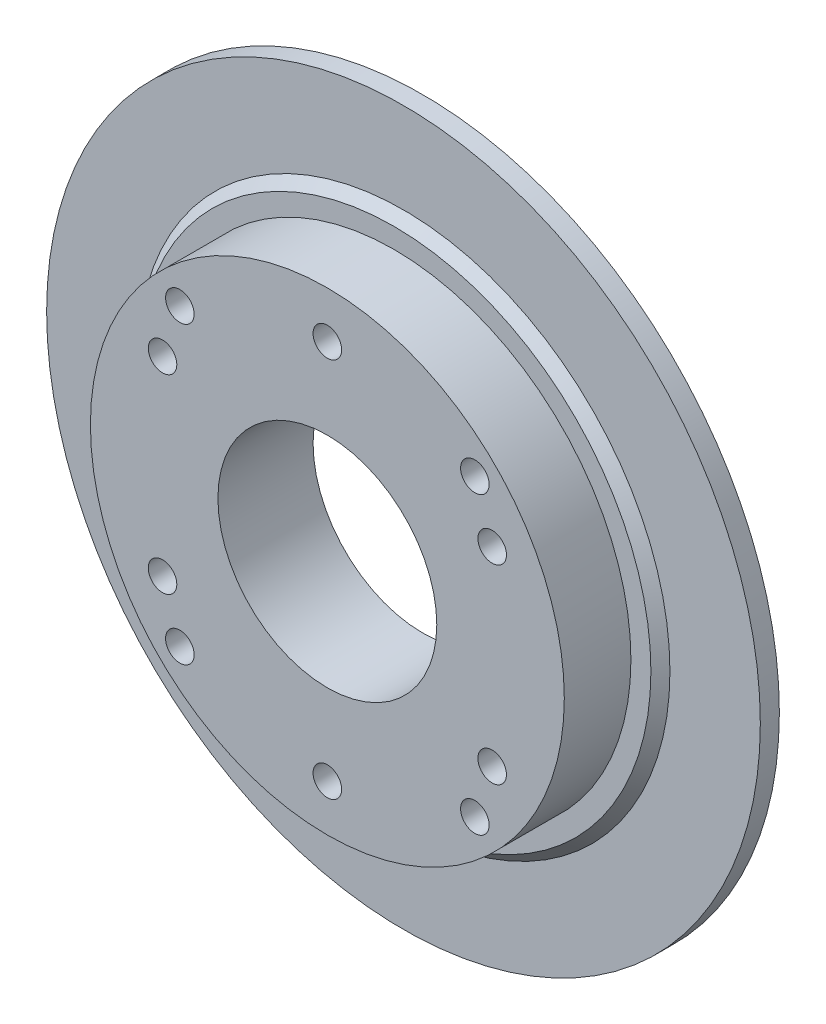
ISO-10303-21;
HEADER;
FILE_DESCRIPTION(('STEP AP214'),'2;1');
FILE_NAME('part.step','',(''),(''),'','','');
FILE_SCHEMA(('AUTOMOTIVE_DESIGN { 1 0 10303 214 1 1 1 1 }'));
ENDSEC;
DATA;
#1=APPLICATION_CONTEXT('core data for automotive mechanical design processes');
#2=APPLICATION_PROTOCOL_DEFINITION('international standard','automotive_design',2000,#1);
#3=PRODUCT_CONTEXT('',#1,'mechanical');
#4=PRODUCT('Part','Part','',(#3));
#5=PRODUCT_RELATED_PRODUCT_CATEGORY('part','',(#4));
#6=PRODUCT_DEFINITION_FORMATION('','',#4);
#7=PRODUCT_DEFINITION_CONTEXT('part definition',#1,'design');
#8=PRODUCT_DEFINITION('design','',#6,#7);
#9=PRODUCT_DEFINITION_SHAPE('','',#8);
#10=(LENGTH_UNIT() NAMED_UNIT(*) SI_UNIT(.MILLI.,.METRE.));
#11=(NAMED_UNIT(*) PLANE_ANGLE_UNIT() SI_UNIT($,.RADIAN.));
#12=(NAMED_UNIT(*) SI_UNIT($,.STERADIAN.) SOLID_ANGLE_UNIT());
#13=UNCERTAINTY_MEASURE_WITH_UNIT(LENGTH_MEASURE(1.E-05),#10,'distance_accuracy_value','');
#14=(GEOMETRIC_REPRESENTATION_CONTEXT(3) GLOBAL_UNCERTAINTY_ASSIGNED_CONTEXT((#13)) GLOBAL_UNIT_ASSIGNED_CONTEXT((#10,
#11,#12)) REPRESENTATION_CONTEXT('',''));
#15=CARTESIAN_POINT('',(0.,0.,0.));
#16=DIRECTION('',(0.,0.,1.));
#17=DIRECTION('',(1.,0.,0.));
#18=AXIS2_PLACEMENT_3D('',#15,#16,#17);
#19=CARTESIAN_POINT('',(0.,0.,2.));
#20=DIRECTION('',(0.,0.,-1.));
#21=DIRECTION('',(-1.,0.,0.));
#22=AXIS2_PLACEMENT_3D('',#19,#20,#21);
#23=CYLINDRICAL_SURFACE('',#22,37.5);
#24=CARTESIAN_POINT('',(0.,0.,2.));
#25=DIRECTION('',(0.,0.,1.));
#26=DIRECTION('',(1.,0.,0.));
#27=AXIS2_PLACEMENT_3D('',#24,#25,#26);
#28=CIRCLE('',#27,37.5);
#29=CARTESIAN_POINT('',(37.5,0.,2.));
#30=VERTEX_POINT('',#29);
#31=EDGE_CURVE('E56',#30,#30,#28,.T.);
#32=ORIENTED_EDGE('',*,*,#31,.F.);
#33=EDGE_LOOP('',(#32));
#34=FACE_BOUND('',#33,.T.);
#35=CARTESIAN_POINT('',(0.,0.,0.));
#36=DIRECTION('',(0.,0.,1.));
#37=DIRECTION('',(1.,0.,0.));
#38=AXIS2_PLACEMENT_3D('',#35,#36,#37);
#39=CIRCLE('',#38,37.5);
#40=CARTESIAN_POINT('',(37.5,0.,0.));
#41=VERTEX_POINT('',#40);
#42=EDGE_CURVE('E63',#41,#41,#39,.T.);
#43=ORIENTED_EDGE('',*,*,#42,.T.);
#44=EDGE_LOOP('',(#43));
#45=FACE_BOUND('',#44,.T.);
#46=ADVANCED_FACE('F39',(#34,#45),#23,.T.);
#47=CARTESIAN_POINT('',(0.,0.,2.));
#48=DIRECTION('',(0.,0.,1.));
#49=DIRECTION('',(1.,0.,0.));
#50=AXIS2_PLACEMENT_3D('',#47,#48,#49);
#51=PLANE('',#50);
#52=CARTESIAN_POINT('',(0.,0.,2.));
#53=DIRECTION('',(0.,0.,1.));
#54=DIRECTION('',(1.,0.,0.));
#55=AXIS2_PLACEMENT_3D('',#52,#53,#54);
#56=CIRCLE('',#55,28.);
#57=CARTESIAN_POINT('',(28.,0.,2.));
#58=VERTEX_POINT('',#57);
#59=EDGE_CURVE('E51',#58,#58,#56,.T.);
#60=ORIENTED_EDGE('',*,*,#59,.F.);
#61=EDGE_LOOP('',(#60));
#62=FACE_BOUND('',#61,.T.);
#63=ORIENTED_EDGE('',*,*,#31,.T.);
#64=EDGE_LOOP('',(#63));
#65=FACE_BOUND('',#64,.T.);
#66=ADVANCED_FACE('F185',(#62,#65),#51,.T.);
#67=CARTESIAN_POINT('',(0.,0.,0.));
#68=DIRECTION('',(0.,0.,1.));
#69=DIRECTION('',(1.,0.,0.));
#70=AXIS2_PLACEMENT_3D('',#67,#68,#69);
#71=PLANE('',#70);
#72=CARTESIAN_POINT('',(-15.4999999999997,-15.5,0.));
#73=DIRECTION('',(0.,0.,1.));
#74=DIRECTION('',(1.,0.,0.));
#75=AXIS2_PLACEMENT_3D('',#72,#73,#74);
#76=CIRCLE('',#75,1.5);
#77=CARTESIAN_POINT('',(-13.9999999999997,-15.5,0.));
#78=VERTEX_POINT('',#77);
#79=EDGE_CURVE('E85',#78,#78,#76,.T.);
#80=ORIENTED_EDGE('',*,*,#79,.T.);
#81=EDGE_LOOP('',(#80));
#82=FACE_BOUND('',#81,.T.);
#83=CARTESIAN_POINT('',(15.5000000000003,-15.5,0.));
#84=DIRECTION('',(0.,0.,1.));
#85=DIRECTION('',(1.,0.,0.));
#86=AXIS2_PLACEMENT_3D('',#83,#84,#85);
#87=CIRCLE('',#86,1.5);
#88=CARTESIAN_POINT('',(17.0000000000003,-15.5,0.));
#89=VERTEX_POINT('',#88);
#90=EDGE_CURVE('E92',#89,#89,#87,.T.);
#91=ORIENTED_EDGE('',*,*,#90,.T.);
#92=EDGE_LOOP('',(#91));
#93=FACE_BOUND('',#92,.T.);
#94=CARTESIAN_POINT('',(15.5,15.5,0.));
#95=DIRECTION('',(0.,0.,1.));
#96=DIRECTION('',(1.,0.,0.));
#97=AXIS2_PLACEMENT_3D('',#94,#95,#96);
#98=CIRCLE('',#97,1.5);
#99=CARTESIAN_POINT('',(17.,15.5,0.));
#100=VERTEX_POINT('',#99);
#101=EDGE_CURVE('E98',#100,#100,#98,.T.);
#102=ORIENTED_EDGE('',*,*,#101,.T.);
#103=EDGE_LOOP('',(#102));
#104=FACE_BOUND('',#103,.T.);
#105=CARTESIAN_POINT('',(-15.5,15.5,0.));
#106=DIRECTION('',(0.,0.,1.));
#107=DIRECTION('',(1.,0.,0.));
#108=AXIS2_PLACEMENT_3D('',#105,#106,#107);
#109=CIRCLE('',#108,1.5);
#110=CARTESIAN_POINT('',(-14.,15.5,0.));
#111=VERTEX_POINT('',#110);
#112=EDGE_CURVE('E77',#111,#111,#109,.T.);
#113=ORIENTED_EDGE('',*,*,#112,.T.);
#114=EDGE_LOOP('',(#113));
#115=FACE_BOUND('',#114,.T.);
#116=CARTESIAN_POINT('',(0.,0.,0.));
#117=DIRECTION('',(0.,0.,1.));
#118=DIRECTION('',(1.,0.,0.));
#119=AXIS2_PLACEMENT_3D('',#116,#117,#118);
#120=CIRCLE('',#119,11.5);
#121=CARTESIAN_POINT('',(11.5,0.,0.));
#122=VERTEX_POINT('',#121);
#123=EDGE_CURVE('E68',#122,#122,#120,.T.);
#124=ORIENTED_EDGE('',*,*,#123,.T.);
#125=EDGE_LOOP('',(#124));
#126=FACE_BOUND('',#125,.T.);
#127=ORIENTED_EDGE('',*,*,#42,.F.);
#128=EDGE_LOOP('',(#127));
#129=FACE_BOUND('',#128,.T.);
#130=ADVANCED_FACE('F190',(#82,#93,#104,#115,#126,#129),#71,.F.);
#131=CARTESIAN_POINT('',(0.,0.,3.));
#132=DIRECTION('',(0.,0.,1.));
#133=DIRECTION('',(1.,0.,0.));
#134=AXIS2_PLACEMENT_3D('',#131,#132,#133);
#135=PLANE('',#134);
#136=CARTESIAN_POINT('',(0.,0.,3.));
#137=DIRECTION('',(0.,0.,1.));
#138=DIRECTION('',(1.,0.,0.));
#139=AXIS2_PLACEMENT_3D('',#136,#137,#138);
#140=CIRCLE('',#139,27.);
#141=CARTESIAN_POINT('',(27.,0.,3.));
#142=VERTEX_POINT('',#141);
#143=EDGE_CURVE('E10',#142,#142,#140,.T.);
#144=ORIENTED_EDGE('',*,*,#143,.T.);
#145=EDGE_LOOP('',(#144));
#146=FACE_BOUND('',#145,.T.);
#147=CARTESIAN_POINT('',(0.,0.,3.));
#148=DIRECTION('',(0.,0.,1.));
#149=DIRECTION('',(1.,0.,0.));
#150=AXIS2_PLACEMENT_3D('',#147,#148,#149);
#151=CIRCLE('',#150,24.9);
#152=CARTESIAN_POINT('',(24.9,0.,3.));
#153=VERTEX_POINT('',#152);
#154=EDGE_CURVE('E47',#153,#153,#151,.T.);
#155=ORIENTED_EDGE('',*,*,#154,.F.);
#156=EDGE_LOOP('',(#155));
#157=FACE_BOUND('',#156,.T.);
#158=ADVANCED_FACE('F196',(#146,#157),#135,.T.);
#159=CARTESIAN_POINT('',(0.,0.,10.));
#160=DIRECTION('',(0.,0.,-1.));
#161=DIRECTION('',(-1.,0.,0.));
#162=AXIS2_PLACEMENT_3D('',#159,#160,#161);
#163=CYLINDRICAL_SURFACE('',#162,24.9);
#164=CARTESIAN_POINT('',(0.,0.,10.));
#165=DIRECTION('',(0.,0.,1.));
#166=DIRECTION('',(1.,0.,0.));
#167=AXIS2_PLACEMENT_3D('',#164,#165,#166);
#168=CIRCLE('',#167,24.9);
#169=CARTESIAN_POINT('',(24.9,0.,10.));
#170=VERTEX_POINT('',#169);
#171=EDGE_CURVE('E59',#170,#170,#168,.T.);
#172=ORIENTED_EDGE('',*,*,#171,.F.);
#173=EDGE_LOOP('',(#172));
#174=FACE_BOUND('',#173,.T.);
#175=ORIENTED_EDGE('',*,*,#154,.T.);
#176=EDGE_LOOP('',(#175));
#177=FACE_BOUND('',#176,.T.);
#178=ADVANCED_FACE('F152',(#174,#177),#163,.T.);
#179=CARTESIAN_POINT('',(0.,0.,10.));
#180=DIRECTION('',(0.,0.,1.));
#181=DIRECTION('',(1.,0.,0.));
#182=AXIS2_PLACEMENT_3D('',#179,#180,#181);
#183=PLANE('',#182);
#184=CARTESIAN_POINT('',(1.35308431126191E-13,20.,10.));
#185=DIRECTION('',(0.,0.,1.));
#186=DIRECTION('',(1.,0.,0.));
#187=AXIS2_PLACEMENT_3D('',#184,#185,#186);
#188=CIRCLE('',#187,1.5);
#189=CARTESIAN_POINT('',(1.50000000000014,20.,10.));
#190=VERTEX_POINT('',#189);
#191=EDGE_CURVE('E128',#190,#190,#188,.T.);
#192=ORIENTED_EDGE('',*,*,#191,.F.);
#193=EDGE_LOOP('',(#192));
#194=FACE_BOUND('',#193,.T.);
#195=CARTESIAN_POINT('',(-17.3205080756887,10.0000000000001,10.));
#196=DIRECTION('',(0.,0.,1.));
#197=DIRECTION('',(1.,0.,0.));
#198=AXIS2_PLACEMENT_3D('',#195,#196,#197);
#199=CIRCLE('',#198,1.5);
#200=CARTESIAN_POINT('',(-15.8205080756887,10.0000000000001,10.));
#201=VERTEX_POINT('',#200);
#202=EDGE_CURVE('E107',#201,#201,#199,.T.);
#203=ORIENTED_EDGE('',*,*,#202,.F.);
#204=EDGE_LOOP('',(#203));
#205=FACE_BOUND('',#204,.T.);
#206=CARTESIAN_POINT('',(17.3205080756889,9.99999999999984,10.));
#207=DIRECTION('',(0.,0.,1.));
#208=DIRECTION('',(1.,0.,0.));
#209=AXIS2_PLACEMENT_3D('',#206,#207,#208);
#210=CIRCLE('',#209,1.5);
#211=CARTESIAN_POINT('',(18.8205080756889,9.99999999999984,10.));
#212=VERTEX_POINT('',#211);
#213=EDGE_CURVE('E106',#212,#212,#210,.T.);
#214=ORIENTED_EDGE('',*,*,#213,.F.);
#215=EDGE_LOOP('',(#214));
#216=FACE_BOUND('',#215,.T.);
#217=CARTESIAN_POINT('',(17.3205080756887,-10.0000000000002,10.));
#218=DIRECTION('',(0.,0.,1.));
#219=DIRECTION('',(1.,0.,0.));
#220=AXIS2_PLACEMENT_3D('',#217,#218,#219);
#221=CIRCLE('',#220,1.5);
#222=CARTESIAN_POINT('',(18.8205080756887,-10.0000000000002,10.));
#223=VERTEX_POINT('',#222);
#224=EDGE_CURVE('E113',#223,#223,#221,.T.);
#225=ORIENTED_EDGE('',*,*,#224,.F.);
#226=EDGE_LOOP('',(#225));
#227=FACE_BOUND('',#226,.T.);
#228=CARTESIAN_POINT('',(-2.81025203108243E-13,-20.,10.));
#229=DIRECTION('',(0.,0.,1.));
#230=DIRECTION('',(1.,0.,0.));
#231=AXIS2_PLACEMENT_3D('',#228,#229,#230);
#232=CIRCLE('',#231,1.5);
#233=CARTESIAN_POINT('',(1.49999999999972,-20.,10.));
#234=VERTEX_POINT('',#233);
#235=EDGE_CURVE('E119',#234,#234,#232,.T.);
#236=ORIENTED_EDGE('',*,*,#235,.F.);
#237=EDGE_LOOP('',(#236));
#238=FACE_BOUND('',#237,.T.);
#239=CARTESIAN_POINT('',(-17.3205080756888,-9.99999999999996,10.));
#240=DIRECTION('',(0.,0.,1.));
#241=DIRECTION('',(1.,0.,0.));
#242=AXIS2_PLACEMENT_3D('',#239,#240,#241);
#243=CIRCLE('',#242,1.5);
#244=CARTESIAN_POINT('',(-15.8205080756888,-9.99999999999996,10.));
#245=VERTEX_POINT('',#244);
#246=EDGE_CURVE('E125',#245,#245,#243,.T.);
#247=ORIENTED_EDGE('',*,*,#246,.F.);
#248=EDGE_LOOP('',(#247));
#249=FACE_BOUND('',#248,.T.);
#250=CARTESIAN_POINT('',(-15.4999999999997,-15.5,10.));
#251=DIRECTION('',(0.,0.,1.));
#252=DIRECTION('',(1.,0.,0.));
#253=AXIS2_PLACEMENT_3D('',#250,#251,#252);
#254=CIRCLE('',#253,1.5);
#255=CARTESIAN_POINT('',(-13.9999999999997,-15.5,10.));
#256=VERTEX_POINT('',#255);
#257=EDGE_CURVE('E88',#256,#256,#254,.T.);
#258=ORIENTED_EDGE('',*,*,#257,.F.);
#259=EDGE_LOOP('',(#258));
#260=FACE_BOUND('',#259,.T.);
#261=CARTESIAN_POINT('',(15.5000000000003,-15.5,10.));
#262=DIRECTION('',(0.,0.,1.));
#263=DIRECTION('',(1.,0.,0.));
#264=AXIS2_PLACEMENT_3D('',#261,#262,#263);
#265=CIRCLE('',#264,1.5);
#266=CARTESIAN_POINT('',(17.0000000000003,-15.5,10.));
#267=VERTEX_POINT('',#266);
#268=EDGE_CURVE('E95',#267,#267,#265,.T.);
#269=ORIENTED_EDGE('',*,*,#268,.F.);
#270=EDGE_LOOP('',(#269));
#271=FACE_BOUND('',#270,.T.);
#272=CARTESIAN_POINT('',(15.5,15.5,10.));
#273=DIRECTION('',(0.,0.,1.));
#274=DIRECTION('',(1.,0.,0.));
#275=AXIS2_PLACEMENT_3D('',#272,#273,#274);
#276=CIRCLE('',#275,1.5);
#277=CARTESIAN_POINT('',(17.,15.5,10.));
#278=VERTEX_POINT('',#277);
#279=EDGE_CURVE('E82',#278,#278,#276,.T.);
#280=ORIENTED_EDGE('',*,*,#279,.F.);
#281=EDGE_LOOP('',(#280));
#282=FACE_BOUND('',#281,.T.);
#283=CARTESIAN_POINT('',(-15.5,15.5,10.));
#284=DIRECTION('',(0.,0.,1.));
#285=DIRECTION('',(1.,0.,0.));
#286=AXIS2_PLACEMENT_3D('',#283,#284,#285);
#287=CIRCLE('',#286,1.5);
#288=CARTESIAN_POINT('',(-14.,15.5,10.));
#289=VERTEX_POINT('',#288);
#290=EDGE_CURVE('E79',#289,#289,#287,.T.);
#291=ORIENTED_EDGE('',*,*,#290,.F.);
#292=EDGE_LOOP('',(#291));
#293=FACE_BOUND('',#292,.T.);
#294=CARTESIAN_POINT('',(0.,0.,10.));
#295=DIRECTION('',(0.,0.,1.));
#296=DIRECTION('',(1.,0.,0.));
#297=AXIS2_PLACEMENT_3D('',#294,#295,#296);
#298=CIRCLE('',#297,11.5);
#299=CARTESIAN_POINT('',(11.5,0.,10.));
#300=VERTEX_POINT('',#299);
#301=EDGE_CURVE('E72',#300,#300,#298,.T.);
#302=ORIENTED_EDGE('',*,*,#301,.F.);
#303=EDGE_LOOP('',(#302));
#304=FACE_BOUND('',#303,.T.);
#305=ORIENTED_EDGE('',*,*,#171,.T.);
#306=EDGE_LOOP('',(#305));
#307=FACE_BOUND('',#306,.T.);
#308=ADVANCED_FACE('F148',(#194,#205,#216,#227,#238,#249,#260,#271,#282,#293,#304,#307),#183,.T.);
#309=CARTESIAN_POINT('',(0.,0.,0.));
#310=DIRECTION('',(0.,0.,1.));
#311=DIRECTION('',(1.,0.,0.));
#312=AXIS2_PLACEMENT_3D('',#309,#310,#311);
#313=CYLINDRICAL_SURFACE('',#312,11.5);
#314=ORIENTED_EDGE('',*,*,#123,.F.);
#315=EDGE_LOOP('',(#314));
#316=FACE_BOUND('',#315,.T.);
#317=ORIENTED_EDGE('',*,*,#301,.T.);
#318=EDGE_LOOP('',(#317));
#319=FACE_BOUND('',#318,.T.);
#320=ADVANCED_FACE('F151',(#316,#319),#313,.F.);
#321=CARTESIAN_POINT('',(-15.5,15.5,0.));
#322=DIRECTION('',(0.,0.,1.));
#323=DIRECTION('',(1.,0.,0.));
#324=AXIS2_PLACEMENT_3D('',#321,#322,#323);
#325=CYLINDRICAL_SURFACE('',#324,1.5);
#326=ORIENTED_EDGE('',*,*,#112,.F.);
#327=EDGE_LOOP('',(#326));
#328=FACE_BOUND('',#327,.T.);
#329=ORIENTED_EDGE('',*,*,#290,.T.);
#330=EDGE_LOOP('',(#329));
#331=FACE_BOUND('',#330,.T.);
#332=ADVANCED_FACE('F175',(#328,#331),#325,.F.);
#333=CARTESIAN_POINT('',(15.5,15.5,0.));
#334=DIRECTION('',(0.,0.,1.));
#335=DIRECTION('',(1.,0.,0.));
#336=AXIS2_PLACEMENT_3D('',#333,#334,#335);
#337=CYLINDRICAL_SURFACE('',#336,1.5);
#338=ORIENTED_EDGE('',*,*,#101,.F.);
#339=EDGE_LOOP('',(#338));
#340=FACE_BOUND('',#339,.T.);
#341=ORIENTED_EDGE('',*,*,#279,.T.);
#342=EDGE_LOOP('',(#341));
#343=FACE_BOUND('',#342,.T.);
#344=ADVANCED_FACE('F181',(#340,#343),#337,.F.);
#345=CARTESIAN_POINT('',(15.5000000000003,-15.5,0.));
#346=DIRECTION('',(0.,0.,1.));
#347=DIRECTION('',(1.,0.,0.));
#348=AXIS2_PLACEMENT_3D('',#345,#346,#347);
#349=CYLINDRICAL_SURFACE('',#348,1.5);
#350=ORIENTED_EDGE('',*,*,#90,.F.);
#351=EDGE_LOOP('',(#350));
#352=FACE_BOUND('',#351,.T.);
#353=ORIENTED_EDGE('',*,*,#268,.T.);
#354=EDGE_LOOP('',(#353));
#355=FACE_BOUND('',#354,.T.);
#356=ADVANCED_FACE('F370',(#352,#355),#349,.F.);
#357=CARTESIAN_POINT('',(-15.4999999999997,-15.5,0.));
#358=DIRECTION('',(0.,0.,1.));
#359=DIRECTION('',(1.,0.,0.));
#360=AXIS2_PLACEMENT_3D('',#357,#358,#359);
#361=CYLINDRICAL_SURFACE('',#360,1.5);
#362=ORIENTED_EDGE('',*,*,#79,.F.);
#363=EDGE_LOOP('',(#362));
#364=FACE_BOUND('',#363,.T.);
#365=ORIENTED_EDGE('',*,*,#257,.T.);
#366=EDGE_LOOP('',(#365));
#367=FACE_BOUND('',#366,.T.);
#368=ADVANCED_FACE('F362',(#364,#367),#361,.F.);
#369=CARTESIAN_POINT('',(0.,0.,3.));
#370=DIRECTION('',(0.,0.,-1.));
#371=DIRECTION('',(-1.,0.,0.));
#372=AXIS2_PLACEMENT_3D('',#369,#370,#371);
#373=CONICAL_SURFACE('',#372,27.,0.785398163397448);
#374=ORIENTED_EDGE('',*,*,#59,.T.);
#375=EDGE_LOOP('',(#374));
#376=FACE_BOUND('',#375,.T.);
#377=ORIENTED_EDGE('',*,*,#143,.F.);
#378=EDGE_LOOP('',(#377));
#379=FACE_BOUND('',#378,.T.);
#380=ADVANCED_FACE('F42',(#376,#379),#373,.T.);
#381=CARTESIAN_POINT('',(-17.3205080756888,-9.99999999999996,7.));
#382=DIRECTION('',(0.,0.,1.));
#383=DIRECTION('',(1.,0.,0.));
#384=AXIS2_PLACEMENT_3D('',#381,#382,#383);
#385=CYLINDRICAL_SURFACE('',#384,1.5);
#386=CARTESIAN_POINT('',(-17.3205080756888,-9.99999999999996,7.));
#387=DIRECTION('',(0.,0.,1.));
#388=DIRECTION('',(1.,0.,0.));
#389=AXIS2_PLACEMENT_3D('',#386,#387,#388);
#390=CIRCLE('',#389,1.5);
#391=CARTESIAN_POINT('',(-15.8205080756888,-9.99999999999996,7.));
#392=VERTEX_POINT('',#391);
#393=EDGE_CURVE('E122',#392,#392,#390,.T.);
#394=ORIENTED_EDGE('',*,*,#393,.F.);
#395=EDGE_LOOP('',(#394));
#396=FACE_BOUND('',#395,.T.);
#397=ORIENTED_EDGE('',*,*,#246,.T.);
#398=EDGE_LOOP('',(#397));
#399=FACE_BOUND('',#398,.T.);
#400=ADVANCED_FACE('F223',(#396,#399),#385,.F.);
#401=CARTESIAN_POINT('',(-17.3205080756888,-9.99999999999996,7.));
#402=DIRECTION('',(0.,0.,1.));
#403=DIRECTION('',(1.,0.,0.));
#404=AXIS2_PLACEMENT_3D('',#401,#402,#403);
#405=PLANE('',#404);
#406=ORIENTED_EDGE('',*,*,#393,.T.);
#407=EDGE_LOOP('',(#406));
#408=FACE_BOUND('',#407,.T.);
#409=ADVANCED_FACE('F228',(#408),#405,.T.);
#410=CARTESIAN_POINT('',(-2.81025203108243E-13,-20.,7.));
#411=DIRECTION('',(0.,0.,1.));
#412=DIRECTION('',(1.,0.,0.));
#413=AXIS2_PLACEMENT_3D('',#410,#411,#412);
#414=CYLINDRICAL_SURFACE('',#413,1.5);
#415=CARTESIAN_POINT('',(-2.81025203108243E-13,-20.,7.));
#416=DIRECTION('',(0.,0.,1.));
#417=DIRECTION('',(1.,0.,0.));
#418=AXIS2_PLACEMENT_3D('',#415,#416,#417);
#419=CIRCLE('',#418,1.5);
#420=CARTESIAN_POINT('',(1.49999999999972,-20.,7.));
#421=VERTEX_POINT('',#420);
#422=EDGE_CURVE('E116',#421,#421,#419,.T.);
#423=ORIENTED_EDGE('',*,*,#422,.F.);
#424=EDGE_LOOP('',(#423));
#425=FACE_BOUND('',#424,.T.);
#426=ORIENTED_EDGE('',*,*,#235,.T.);
#427=EDGE_LOOP('',(#426));
#428=FACE_BOUND('',#427,.T.);
#429=ADVANCED_FACE('F239',(#425,#428),#414,.F.);
#430=CARTESIAN_POINT('',(-2.81025203108243E-13,-20.,7.));
#431=DIRECTION('',(0.,0.,1.));
#432=DIRECTION('',(1.,0.,0.));
#433=AXIS2_PLACEMENT_3D('',#430,#431,#432);
#434=PLANE('',#433);
#435=ORIENTED_EDGE('',*,*,#422,.T.);
#436=EDGE_LOOP('',(#435));
#437=FACE_BOUND('',#436,.T.);
#438=ADVANCED_FACE('F250',(#437),#434,.T.);
#439=CARTESIAN_POINT('',(17.3205080756887,-10.0000000000002,7.));
#440=DIRECTION('',(0.,0.,1.));
#441=DIRECTION('',(1.,0.,0.));
#442=AXIS2_PLACEMENT_3D('',#439,#440,#441);
#443=CYLINDRICAL_SURFACE('',#442,1.5);
#444=CARTESIAN_POINT('',(17.3205080756887,-10.0000000000002,7.));
#445=DIRECTION('',(0.,0.,1.));
#446=DIRECTION('',(1.,0.,0.));
#447=AXIS2_PLACEMENT_3D('',#444,#445,#446);
#448=CIRCLE('',#447,1.5);
#449=CARTESIAN_POINT('',(18.8205080756887,-10.0000000000002,7.));
#450=VERTEX_POINT('',#449);
#451=EDGE_CURVE('E110',#450,#450,#448,.T.);
#452=ORIENTED_EDGE('',*,*,#451,.F.);
#453=EDGE_LOOP('',(#452));
#454=FACE_BOUND('',#453,.T.);
#455=ORIENTED_EDGE('',*,*,#224,.T.);
#456=EDGE_LOOP('',(#455));
#457=FACE_BOUND('',#456,.T.);
#458=ADVANCED_FACE('F261',(#454,#457),#443,.F.);
#459=CARTESIAN_POINT('',(17.3205080756887,-10.0000000000002,7.));
#460=DIRECTION('',(0.,0.,1.));
#461=DIRECTION('',(1.,0.,0.));
#462=AXIS2_PLACEMENT_3D('',#459,#460,#461);
#463=PLANE('',#462);
#464=ORIENTED_EDGE('',*,*,#451,.T.);
#465=EDGE_LOOP('',(#464));
#466=FACE_BOUND('',#465,.T.);
#467=ADVANCED_FACE('F272',(#466),#463,.T.);
#468=CARTESIAN_POINT('',(17.3205080756889,9.99999999999984,7.));
#469=DIRECTION('',(0.,0.,1.));
#470=DIRECTION('',(1.,0.,0.));
#471=AXIS2_PLACEMENT_3D('',#468,#469,#470);
#472=CYLINDRICAL_SURFACE('',#471,1.5);
#473=CARTESIAN_POINT('',(17.3205080756889,9.99999999999984,7.));
#474=DIRECTION('',(0.,0.,1.));
#475=DIRECTION('',(1.,0.,0.));
#476=AXIS2_PLACEMENT_3D('',#473,#474,#475);
#477=CIRCLE('',#476,1.5);
#478=CARTESIAN_POINT('',(18.8205080756889,9.99999999999984,7.));
#479=VERTEX_POINT('',#478);
#480=EDGE_CURVE('E103',#479,#479,#477,.T.);
#481=ORIENTED_EDGE('',*,*,#480,.F.);
#482=EDGE_LOOP('',(#481));
#483=FACE_BOUND('',#482,.T.);
#484=ORIENTED_EDGE('',*,*,#213,.T.);
#485=EDGE_LOOP('',(#484));
#486=FACE_BOUND('',#485,.T.);
#487=ADVANCED_FACE('F283',(#483,#486),#472,.F.);
#488=CARTESIAN_POINT('',(17.3205080756889,9.99999999999984,7.));
#489=DIRECTION('',(0.,0.,1.));
#490=DIRECTION('',(1.,0.,0.));
#491=AXIS2_PLACEMENT_3D('',#488,#489,#490);
#492=PLANE('',#491);
#493=ORIENTED_EDGE('',*,*,#480,.T.);
#494=EDGE_LOOP('',(#493));
#495=FACE_BOUND('',#494,.T.);
#496=ADVANCED_FACE('F294',(#495),#492,.T.);
#497=CARTESIAN_POINT('',(-17.3205080756887,10.0000000000001,7.));
#498=DIRECTION('',(0.,0.,1.));
#499=DIRECTION('',(1.,0.,0.));
#500=AXIS2_PLACEMENT_3D('',#497,#498,#499);
#501=CYLINDRICAL_SURFACE('',#500,1.5);
#502=CARTESIAN_POINT('',(-17.3205080756887,10.0000000000001,7.));
#503=DIRECTION('',(0.,0.,1.));
#504=DIRECTION('',(1.,0.,0.));
#505=AXIS2_PLACEMENT_3D('',#502,#503,#504);
#506=CIRCLE('',#505,1.5);
#507=CARTESIAN_POINT('',(-15.8205080756887,10.0000000000001,7.));
#508=VERTEX_POINT('',#507);
#509=EDGE_CURVE('E129',#508,#508,#506,.T.);
#510=ORIENTED_EDGE('',*,*,#509,.F.);
#511=EDGE_LOOP('',(#510));
#512=FACE_BOUND('',#511,.T.);
#513=ORIENTED_EDGE('',*,*,#202,.T.);
#514=EDGE_LOOP('',(#513));
#515=FACE_BOUND('',#514,.T.);
#516=ADVANCED_FACE('F305',(#512,#515),#501,.F.);
#517=CARTESIAN_POINT('',(-17.3205080756887,10.0000000000001,7.));
#518=DIRECTION('',(0.,0.,1.));
#519=DIRECTION('',(1.,0.,0.));
#520=AXIS2_PLACEMENT_3D('',#517,#518,#519);
#521=PLANE('',#520);
#522=ORIENTED_EDGE('',*,*,#509,.T.);
#523=EDGE_LOOP('',(#522));
#524=FACE_BOUND('',#523,.T.);
#525=ADVANCED_FACE('F144',(#524),#521,.T.);
#526=CARTESIAN_POINT('',(1.35308431126191E-13,20.,7.));
#527=DIRECTION('',(0.,0.,1.));
#528=DIRECTION('',(1.,0.,0.));
#529=AXIS2_PLACEMENT_3D('',#526,#527,#528);
#530=CYLINDRICAL_SURFACE('',#529,1.5);
#531=CARTESIAN_POINT('',(1.35308431126191E-13,20.,7.));
#532=DIRECTION('',(0.,0.,1.));
#533=DIRECTION('',(1.,0.,0.));
#534=AXIS2_PLACEMENT_3D('',#531,#532,#533);
#535=CIRCLE('',#534,1.5);
#536=CARTESIAN_POINT('',(1.50000000000014,20.,7.));
#537=VERTEX_POINT('',#536);
#538=EDGE_CURVE('E89',#537,#537,#535,.T.);
#539=ORIENTED_EDGE('',*,*,#538,.F.);
#540=EDGE_LOOP('',(#539));
#541=FACE_BOUND('',#540,.T.);
#542=ORIENTED_EDGE('',*,*,#191,.T.);
#543=EDGE_LOOP('',(#542));
#544=FACE_BOUND('',#543,.T.);
#545=ADVANCED_FACE('F141',(#541,#544),#530,.F.);
#546=CARTESIAN_POINT('',(0.,0.,7.));
#547=DIRECTION('',(0.,0.,1.));
#548=DIRECTION('',(1.,0.,0.));
#549=AXIS2_PLACEMENT_3D('',#546,#547,#548);
#550=PLANE('',#549);
#551=ORIENTED_EDGE('',*,*,#538,.T.);
#552=EDGE_LOOP('',(#551));
#553=FACE_BOUND('',#552,.T.);
#554=ADVANCED_FACE('F139',(#553),#550,.T.);
#555=CLOSED_SHELL('',(#46,#66,#130,#158,#178,#308,#320,#332,#344,#356,#368,#380,#400,#409,#429,
#438,#458,#467,#487,#496,#516,#525,#545,#554));
#556=MANIFOLD_SOLID_BREP('B2',#555);
#557=ADVANCED_BREP_SHAPE_REPRESENTATION('',(#18,#556),#14);
#558=SHAPE_DEFINITION_REPRESENTATION(#9,#557);
ENDSEC;
END-ISO-10303-21;
